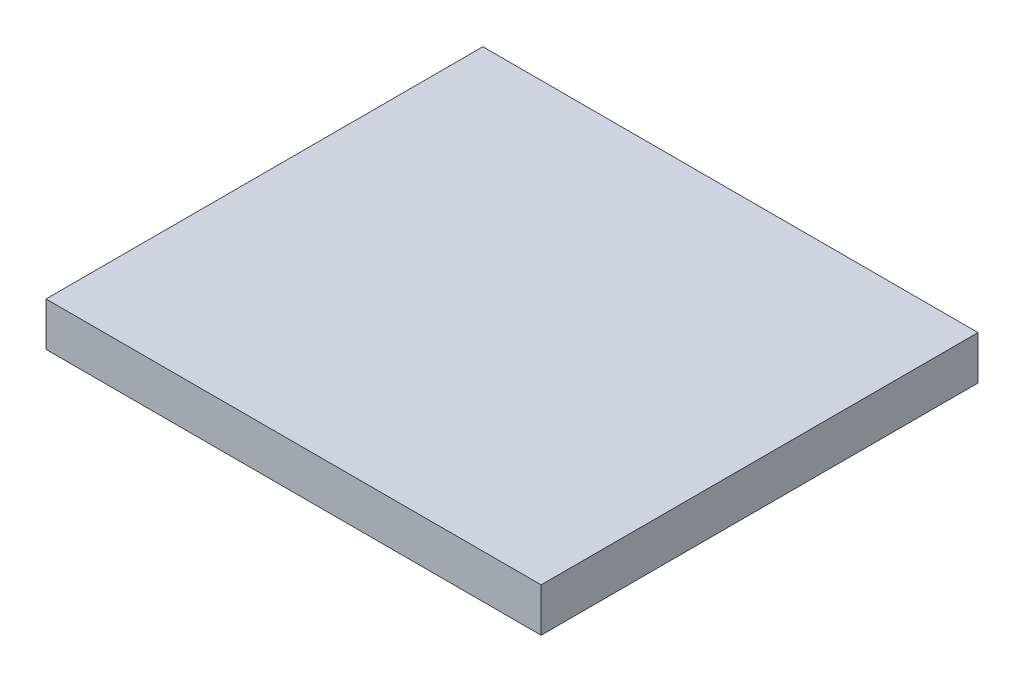
ISO-10303-21;
HEADER;
FILE_DESCRIPTION(('STEP AP214'),'2;1');
FILE_NAME('part.step','',(''),(''),'','','');
FILE_SCHEMA(('AUTOMOTIVE_DESIGN { 1 0 10303 214 1 1 1 1 }'));
ENDSEC;
DATA;
#1=APPLICATION_CONTEXT('core data for automotive mechanical design processes');
#2=APPLICATION_PROTOCOL_DEFINITION('international standard','automotive_design',2000,#1);
#3=PRODUCT_CONTEXT('',#1,'mechanical');
#4=PRODUCT('Part','Part','',(#3));
#5=PRODUCT_RELATED_PRODUCT_CATEGORY('part','',(#4));
#6=PRODUCT_DEFINITION_FORMATION('','',#4);
#7=PRODUCT_DEFINITION_CONTEXT('part definition',#1,'design');
#8=PRODUCT_DEFINITION('design','',#6,#7);
#9=PRODUCT_DEFINITION_SHAPE('','',#8);
#10=(LENGTH_UNIT() NAMED_UNIT(*) SI_UNIT(.MILLI.,.METRE.));
#11=(NAMED_UNIT(*) PLANE_ANGLE_UNIT() SI_UNIT($,.RADIAN.));
#12=(NAMED_UNIT(*) SI_UNIT($,.STERADIAN.) SOLID_ANGLE_UNIT());
#13=UNCERTAINTY_MEASURE_WITH_UNIT(LENGTH_MEASURE(1.E-05),#10,'distance_accuracy_value','');
#14=(GEOMETRIC_REPRESENTATION_CONTEXT(3) GLOBAL_UNCERTAINTY_ASSIGNED_CONTEXT((#13)) GLOBAL_UNIT_ASSIGNED_CONTEXT((#10,
#11,#12)) REPRESENTATION_CONTEXT('',''));
#15=CARTESIAN_POINT('',(0.,0.,0.));
#16=DIRECTION('',(0.,0.,1.));
#17=DIRECTION('',(1.,0.,0.));
#18=AXIS2_PLACEMENT_3D('',#15,#16,#17);
#19=CARTESIAN_POINT('',(0.,0.,30.));
#20=DIRECTION('',(-1.,0.,0.));
#21=DIRECTION('',(0.,0.,1.));
#22=AXIS2_PLACEMENT_3D('',#19,#20,#21);
#23=PLANE('',#22);
#24=DIRECTION('',(0.,1.,0.));
#25=VECTOR('',#24,1.);
#26=CARTESIAN_POINT('',(0.,0.,0.));
#27=LINE('',#26,#25);
#28=CARTESIAN_POINT('',(0.,0.,0.));
#29=VERTEX_POINT('',#28);
#30=CARTESIAN_POINT('',(0.,3.,0.));
#31=VERTEX_POINT('',#30);
#32=EDGE_CURVE('E96',#29,#31,#27,.T.);
#33=ORIENTED_EDGE('',*,*,#32,.T.);
#34=DIRECTION('',(0.,0.,-1.));
#35=VECTOR('',#34,1.);
#36=CARTESIAN_POINT('',(0.,3.,30.));
#37=LINE('',#36,#35);
#38=CARTESIAN_POINT('',(0.,3.,30.));
#39=VERTEX_POINT('',#38);
#40=EDGE_CURVE('E11',#39,#31,#37,.T.);
#41=ORIENTED_EDGE('',*,*,#40,.F.);
#42=DIRECTION('',(0.,1.,0.));
#43=VECTOR('',#42,1.);
#44=CARTESIAN_POINT('',(0.,0.,30.));
#45=LINE('',#44,#43);
#46=CARTESIAN_POINT('',(0.,0.,30.));
#47=VERTEX_POINT('',#46);
#48=EDGE_CURVE('E84',#47,#39,#45,.T.);
#49=ORIENTED_EDGE('',*,*,#48,.F.);
#50=DIRECTION('',(0.,0.,-1.));
#51=VECTOR('',#50,1.);
#52=CARTESIAN_POINT('',(0.,0.,30.));
#53=LINE('',#52,#51);
#54=EDGE_CURVE('E92',#47,#29,#53,.T.);
#55=ORIENTED_EDGE('',*,*,#54,.T.);
#56=EDGE_LOOP('',(#33,#41,#49,#55));
#57=FACE_BOUND('',#56,.T.);
#58=ADVANCED_FACE('F33',(#57),#23,.F.);
#59=CARTESIAN_POINT('',(0.,3.,30.));
#60=DIRECTION('',(0.,-1.,0.));
#61=DIRECTION('',(1.,0.,0.));
#62=AXIS2_PLACEMENT_3D('',#59,#60,#61);
#63=PLANE('',#62);
#64=DIRECTION('',(-1.,0.,0.));
#65=VECTOR('',#64,1.);
#66=CARTESIAN_POINT('',(0.,3.,0.));
#67=LINE('',#66,#65);
#68=CARTESIAN_POINT('',(-34.,3.,0.));
#69=VERTEX_POINT('',#68);
#70=EDGE_CURVE('E88',#31,#69,#67,.T.);
#71=ORIENTED_EDGE('',*,*,#70,.T.);
#72=DIRECTION('',(0.,0.,-1.));
#73=VECTOR('',#72,1.);
#74=CARTESIAN_POINT('',(-34.,3.,30.));
#75=LINE('',#74,#73);
#76=CARTESIAN_POINT('',(-34.,3.,30.));
#77=VERTEX_POINT('',#76);
#78=EDGE_CURVE('E41',#77,#69,#75,.T.);
#79=ORIENTED_EDGE('',*,*,#78,.F.);
#80=DIRECTION('',(-1.,0.,0.));
#81=VECTOR('',#80,1.);
#82=CARTESIAN_POINT('',(0.,3.,30.));
#83=LINE('',#82,#81);
#84=EDGE_CURVE('E79',#39,#77,#83,.T.);
#85=ORIENTED_EDGE('',*,*,#84,.F.);
#86=ORIENTED_EDGE('',*,*,#40,.T.);
#87=EDGE_LOOP('',(#71,#79,#85,#86));
#88=FACE_BOUND('',#87,.T.);
#89=ADVANCED_FACE('F87',(#88),#63,.F.);
#90=CARTESIAN_POINT('',(-34.,0.,30.));
#91=DIRECTION('',(1.,0.,0.));
#92=DIRECTION('',(0.,0.,-1.));
#93=AXIS2_PLACEMENT_3D('',#90,#91,#92);
#94=PLANE('',#93);
#95=DIRECTION('',(0.,-1.,0.));
#96=VECTOR('',#95,1.);
#97=CARTESIAN_POINT('',(-34.,0.,0.));
#98=LINE('',#97,#96);
#99=CARTESIAN_POINT('',(-34.,0.,0.));
#100=VERTEX_POINT('',#99);
#101=EDGE_CURVE('E66',#69,#100,#98,.T.);
#102=ORIENTED_EDGE('',*,*,#101,.T.);
#103=DIRECTION('',(0.,0.,-1.));
#104=VECTOR('',#103,1.);
#105=CARTESIAN_POINT('',(-34.,0.,30.));
#106=LINE('',#105,#104);
#107=CARTESIAN_POINT('',(-34.,0.,30.));
#108=VERTEX_POINT('',#107);
#109=EDGE_CURVE('E89',#108,#100,#106,.T.);
#110=ORIENTED_EDGE('',*,*,#109,.F.);
#111=DIRECTION('',(0.,-1.,0.));
#112=VECTOR('',#111,1.);
#113=CARTESIAN_POINT('',(-34.,0.,30.));
#114=LINE('',#113,#112);
#115=EDGE_CURVE('E82',#77,#108,#114,.T.);
#116=ORIENTED_EDGE('',*,*,#115,.F.);
#117=ORIENTED_EDGE('',*,*,#78,.T.);
#118=EDGE_LOOP('',(#102,#110,#116,#117));
#119=FACE_BOUND('',#118,.T.);
#120=ADVANCED_FACE('F90',(#119),#94,.F.);
#121=CARTESIAN_POINT('',(0.,0.,30.));
#122=DIRECTION('',(0.,1.,0.));
#123=DIRECTION('',(-1.,0.,0.));
#124=AXIS2_PLACEMENT_3D('',#121,#122,#123);
#125=PLANE('',#124);
#126=DIRECTION('',(1.,0.,0.));
#127=VECTOR('',#126,1.);
#128=CARTESIAN_POINT('',(0.,0.,0.));
#129=LINE('',#128,#127);
#130=EDGE_CURVE('E72',#100,#29,#129,.T.);
#131=ORIENTED_EDGE('',*,*,#130,.T.);
#132=ORIENTED_EDGE('',*,*,#54,.F.);
#133=DIRECTION('',(1.,0.,0.));
#134=VECTOR('',#133,1.);
#135=CARTESIAN_POINT('',(0.,0.,30.));
#136=LINE('',#135,#134);
#137=EDGE_CURVE('E49',#108,#47,#136,.T.);
#138=ORIENTED_EDGE('',*,*,#137,.F.);
#139=ORIENTED_EDGE('',*,*,#109,.T.);
#140=EDGE_LOOP('',(#131,#132,#138,#139));
#141=FACE_BOUND('',#140,.T.);
#142=ADVANCED_FACE('F103',(#141),#125,.F.);
#143=CARTESIAN_POINT('',(0.,0.,30.));
#144=DIRECTION('',(0.,0.,1.));
#145=DIRECTION('',(1.,0.,0.));
#146=AXIS2_PLACEMENT_3D('',#143,#144,#145);
#147=PLANE('',#146);
#148=ORIENTED_EDGE('',*,*,#48,.T.);
#149=ORIENTED_EDGE('',*,*,#84,.T.);
#150=ORIENTED_EDGE('',*,*,#115,.T.);
#151=ORIENTED_EDGE('',*,*,#137,.T.);
#152=EDGE_LOOP('',(#148,#149,#150,#151));
#153=FACE_BOUND('',#152,.T.);
#154=ADVANCED_FACE('F80',(#153),#147,.T.);
#155=CARTESIAN_POINT('',(0.,0.,0.));
#156=DIRECTION('',(0.,0.,1.));
#157=DIRECTION('',(1.,0.,0.));
#158=AXIS2_PLACEMENT_3D('',#155,#156,#157);
#159=PLANE('',#158);
#160=ORIENTED_EDGE('',*,*,#32,.F.);
#161=ORIENTED_EDGE('',*,*,#130,.F.);
#162=ORIENTED_EDGE('',*,*,#101,.F.);
#163=ORIENTED_EDGE('',*,*,#70,.F.);
#164=EDGE_LOOP('',(#160,#161,#162,#163));
#165=FACE_BOUND('',#164,.T.);
#166=ADVANCED_FACE('F106',(#165),#159,.F.);
#167=CLOSED_SHELL('',(#58,#89,#120,#142,#154,#166));
#168=MANIFOLD_SOLID_BREP('B2',#167);
#169=ADVANCED_BREP_SHAPE_REPRESENTATION('',(#18,#168),#14);
#170=SHAPE_DEFINITION_REPRESENTATION(#9,#169);
ENDSEC;
END-ISO-10303-21;
